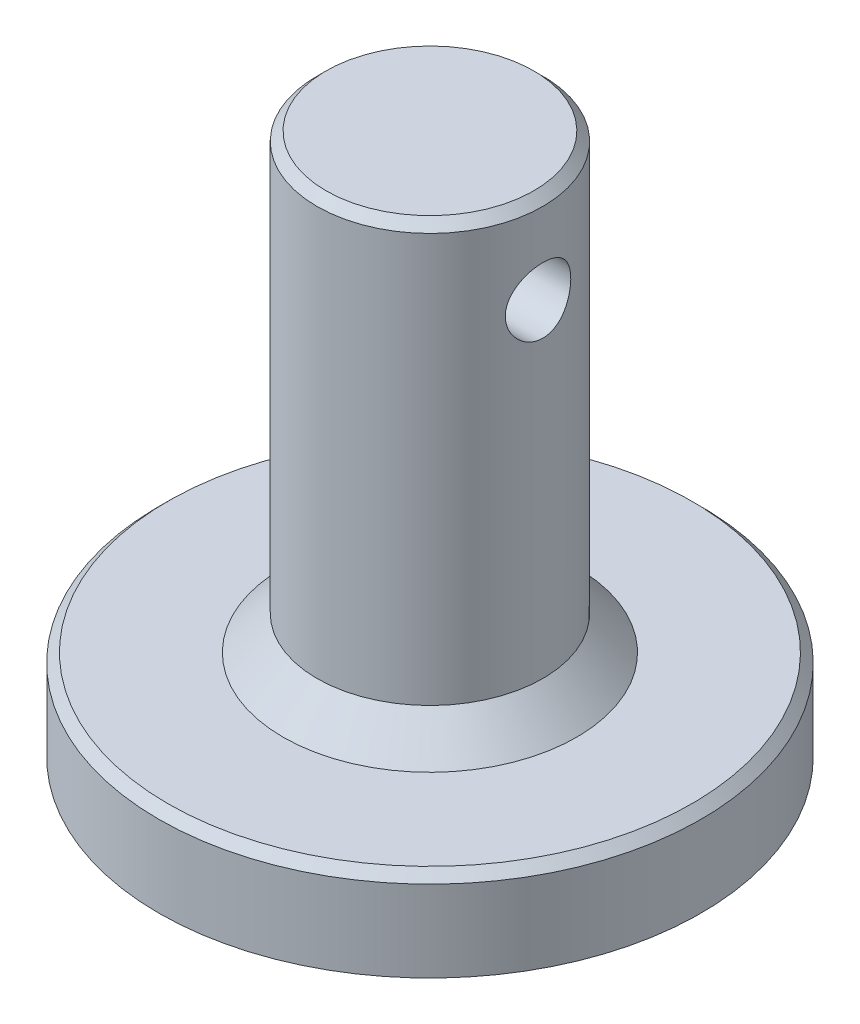
ISO-10303-21;
HEADER;
FILE_DESCRIPTION(('STEP AP214'),'2;1');
FILE_NAME('part.step','',(''),(''),'','','');
FILE_SCHEMA(('AUTOMOTIVE_DESIGN { 1 0 10303 214 1 1 1 1 }'));
ENDSEC;
DATA;
#1=APPLICATION_CONTEXT('core data for automotive mechanical design processes');
#2=APPLICATION_PROTOCOL_DEFINITION('international standard','automotive_design',2000,#1);
#3=PRODUCT_CONTEXT('',#1,'mechanical');
#4=PRODUCT('Part','Part','',(#3));
#5=PRODUCT_RELATED_PRODUCT_CATEGORY('part','',(#4));
#6=PRODUCT_DEFINITION_FORMATION('','',#4);
#7=PRODUCT_DEFINITION_CONTEXT('part definition',#1,'design');
#8=PRODUCT_DEFINITION('design','',#6,#7);
#9=PRODUCT_DEFINITION_SHAPE('','',#8);
#10=(LENGTH_UNIT() NAMED_UNIT(*) SI_UNIT(.MILLI.,.METRE.));
#11=(NAMED_UNIT(*) PLANE_ANGLE_UNIT() SI_UNIT($,.RADIAN.));
#12=(NAMED_UNIT(*) SI_UNIT($,.STERADIAN.) SOLID_ANGLE_UNIT());
#13=UNCERTAINTY_MEASURE_WITH_UNIT(LENGTH_MEASURE(1.E-05),#10,'distance_accuracy_value','');
#14=(GEOMETRIC_REPRESENTATION_CONTEXT(3) GLOBAL_UNCERTAINTY_ASSIGNED_CONTEXT((#13)) GLOBAL_UNIT_ASSIGNED_CONTEXT((#10,
#11,#12)) REPRESENTATION_CONTEXT('',''));
#15=CARTESIAN_POINT('',(0.,0.,0.));
#16=DIRECTION('',(0.,0.,1.));
#17=DIRECTION('',(1.,0.,0.));
#18=AXIS2_PLACEMENT_3D('',#15,#16,#17);
#19=CARTESIAN_POINT('',(0.,24.,0.));
#20=DIRECTION('',(0.,-1.,0.));
#21=DIRECTION('',(0.,0.,-1.));
#22=AXIS2_PLACEMENT_3D('',#19,#20,#21);
#23=CYLINDRICAL_SURFACE('',#22,5.);
#24=CARTESIAN_POINT('',(0.,5.50000000000001,0.));
#25=DIRECTION('',(0.,1.,0.));
#26=DIRECTION('',(0.,0.,1.));
#27=AXIS2_PLACEMENT_3D('',#24,#25,#26);
#28=CIRCLE('',#27,5.);
#29=CARTESIAN_POINT('',(0.,5.50000000000001,5.));
#30=VERTEX_POINT('',#29);
#31=EDGE_CURVE('E43',#30,#30,#28,.T.);
#32=ORIENTED_EDGE('',*,*,#31,.T.);
#33=EDGE_LOOP('',(#32));
#34=FACE_BOUND('',#33,.T.);
#35=CARTESIAN_POINT('',(0.,23.6,0.));
#36=DIRECTION('',(0.,1.,0.));
#37=DIRECTION('',(0.,0.,1.));
#38=AXIS2_PLACEMENT_3D('',#35,#36,#37);
#39=CIRCLE('',#38,5.);
#40=CARTESIAN_POINT('',(0.,23.6,5.));
#41=VERTEX_POINT('',#40);
#42=EDGE_CURVE('E47',#41,#41,#39,.F.);
#43=ORIENTED_EDGE('',*,*,#42,.T.);
#44=EDGE_LOOP('',(#43));
#45=FACE_BOUND('',#44,.T.);
#46=CARTESIAN_POINT('',(-4.78513322698543,20.,1.45));
#47=CARTESIAN_POINT('',(-4.78513426283408,20.0795870913655,1.44999869100188));
#48=CARTESIAN_POINT('',(-4.78714050925583,20.1591873017141,1.44342517475206));
#49=CARTESIAN_POINT('',(-4.79491923133851,20.316069345042,1.41736687000352));
#50=CARTESIAN_POINT('',(-4.80069315717547,20.3933502733468,1.3978771100105));
#51=CARTESIAN_POINT('',(-4.8152995031418,20.543300587324,1.34669665964465));
#52=CARTESIAN_POINT('',(-4.82412708202329,20.6159770583786,1.31502527312825));
#53=CARTESIAN_POINT('',(-4.8438396591333,20.7550010265229,1.24044319497749));
#54=CARTESIAN_POINT('',(-4.85472492070628,20.8213477118826,1.19753106446917));
#55=CARTESIAN_POINT('',(-4.87768729729169,20.9477906612898,1.10032746628817));
#56=CARTESIAN_POINT('',(-4.88978851764016,21.0076720528303,1.04576212367778));
#57=CARTESIAN_POINT('',(-4.91361274134648,21.1175752846992,0.927388593971664));
#58=CARTESIAN_POINT('',(-4.92533569902584,21.1675959379569,0.863579295657844));
#59=CARTESIAN_POINT('',(-4.94735485828962,21.2572792601641,0.72701260523335));
#60=CARTESIAN_POINT('',(-4.95761933344942,21.2967245432166,0.654106893761896));
#61=CARTESIAN_POINT('',(-4.97528602486809,21.3627131517366,0.502349395141127));
#62=CARTESIAN_POINT('',(-4.98268881596986,21.3892590686494,0.423498805980456));
#63=CARTESIAN_POINT('',(-4.99362752260969,21.4279892086208,0.264336285612595));
#64=CARTESIAN_POINT('',(-4.99726190344405,21.4405398180832,0.184120398070293));
#65=CARTESIAN_POINT('',(-5.0006002774265,21.4520797882142,0.022644720735508));
#66=CARTESIAN_POINT('',(-5.00030504377207,21.4510718166913,-0.0586148605545906));
#67=CARTESIAN_POINT('',(-4.9958878510329,21.4357729409259,-0.217307208791277));
#68=CARTESIAN_POINT('',(-4.99188011560564,21.4218785030943,-0.294781872826383));
#69=CARTESIAN_POINT('',(-4.98062578548084,21.3818465095015,-0.446248527310061));
#70=CARTESIAN_POINT('',(-4.97337899118619,21.3557081992443,-0.520240302825636));
#71=CARTESIAN_POINT('',(-4.95629932571502,21.2916511473883,-0.663604820945453));
#72=CARTESIAN_POINT('',(-4.94643851687521,21.2536042857988,-0.732916852546144));
#73=CARTESIAN_POINT('',(-4.92518200579398,21.1669104820133,-0.864302061741751));
#74=CARTESIAN_POINT('',(-4.91378595906077,21.1182611592149,-0.92637360879579));
#75=CARTESIAN_POINT('',(-4.89019767838047,21.009671710933,-1.04388263721356));
#76=CARTESIAN_POINT('',(-4.87799155397245,20.9493872555907,-1.09899954763512));
#77=CARTESIAN_POINT('',(-4.85452227840415,20.8203091860323,-1.19842825418313));
#78=CARTESIAN_POINT('',(-4.84325920868936,20.7515148381406,-1.24273911769258));
#79=CARTESIAN_POINT('',(-4.82288798893475,20.6065727314494,-1.31960328482008));
#80=CARTESIAN_POINT('',(-4.81379883432215,20.5303677955544,-1.35205416836745));
#81=CARTESIAN_POINT('',(-4.79903258643307,20.373251542667,-1.40357136759515));
#82=CARTESIAN_POINT('',(-4.79335446529496,20.2923416515077,-1.422641715582));
#83=CARTESIAN_POINT('',(-4.78627675987833,20.1311470156077,-1.44627196475718));
#84=CARTESIAN_POINT('',(-4.78473438843888,20.0509394976596,-1.45131635027333));
#85=CARTESIAN_POINT('',(-4.78570925484049,19.8908236603967,-1.44809884432744));
#86=CARTESIAN_POINT('',(-4.78822596830652,19.8109153037712,-1.43983867162193));
#87=CARTESIAN_POINT('',(-4.7968959615428,19.6556379368374,-1.41067672473847));
#88=CARTESIAN_POINT('',(-4.80296129588655,19.5802061593392,-1.39008039401309));
#89=CARTESIAN_POINT('',(-4.81795561312468,19.4338718536094,-1.33718157289373));
#90=CARTESIAN_POINT('',(-4.826885017938,19.3629699945466,-1.30487735766814));
#91=CARTESIAN_POINT('',(-4.84688324748324,19.225720092423,-1.22854093128491));
#92=CARTESIAN_POINT('',(-4.85800060286684,19.1595332188973,-1.18423196789368));
#93=CARTESIAN_POINT('',(-4.88101483844608,19.0353568761904,-1.08547687518715));
#94=CARTESIAN_POINT('',(-4.89291189242326,18.9773692436364,-1.03102848095157));
#95=CARTESIAN_POINT('',(-4.91664804907019,18.8691522005977,-0.91127366957764));
#96=CARTESIAN_POINT('',(-4.92847060897607,18.8192645739359,-0.845654391675095));
#97=CARTESIAN_POINT('',(-4.95030472487494,18.7312044311332,-0.706697986188916));
#98=CARTESIAN_POINT('',(-4.96031637443399,18.6930313096567,-0.633361257660164));
#99=CARTESIAN_POINT('',(-4.97733750401775,18.6298499779853,-0.481553911308572));
#100=CARTESIAN_POINT('',(-4.98436958850299,18.6047423020208,-0.403127351540741));
#101=CARTESIAN_POINT('',(-4.99473912169655,18.5681371404963,-0.242929422773563));
#102=CARTESIAN_POINT('',(-4.99807755208951,18.556636038579,-0.161158948500439));
#103=CARTESIAN_POINT('',(-5.00062799407149,18.5478307187522,0.000236873074977497));
#104=CARTESIAN_POINT('',(-4.99998455668778,18.5500291950276,0.079833155333161));
#105=CARTESIAN_POINT('',(-4.99497996377191,18.5673824255604,0.237474636793753));
#106=CARTESIAN_POINT('',(-4.99061899573652,18.5825365263902,0.31551991401925));
#107=CARTESIAN_POINT('',(-4.97870683527859,18.6250706578737,0.467131271714106));
#108=CARTESIAN_POINT('',(-4.97118619722582,18.652333734033,0.540732726836403));
#109=CARTESIAN_POINT('',(-4.95373455662155,18.7182077726595,0.682356817223569));
#110=CARTESIAN_POINT('',(-4.94380317373496,18.7568205259301,0.750378569929745));
#111=CARTESIAN_POINT('',(-4.92220347877844,18.8456622812737,0.881159638715791));
#112=CARTESIAN_POINT('',(-4.91049151852829,18.8962089269919,0.943695916936211));
#113=CARTESIAN_POINT('',(-4.88680109909446,19.0069022747151,1.05956576561686));
#114=CARTESIAN_POINT('',(-4.87482256618544,19.0670516616519,1.11289675356803));
#115=CARTESIAN_POINT('',(-4.85157276285652,19.1972154373184,1.21029846596509));
#116=CARTESIAN_POINT('',(-4.84032972653636,19.2674543038983,1.25407665289222));
#117=CARTESIAN_POINT('',(-4.82025779384607,19.414611238388,1.32914783845825));
#118=CARTESIAN_POINT('',(-4.81142760251926,19.4915256942343,1.36044753836902));
#119=CARTESIAN_POINT('',(-4.79816656435598,19.6399143111036,1.40644791063515));
#120=CARTESIAN_POINT('',(-4.79332309408559,19.7108624483056,1.42273711459614));
#121=CARTESIAN_POINT('',(-4.78680622092027,19.8545369402224,1.44451284122198));
#122=CARTESIAN_POINT('',(-4.78513228029255,19.9272629911807,1.45000119633229));
#123=CARTESIAN_POINT('',(-4.78513322698543,20.,1.45));
#124=B_SPLINE_CURVE_WITH_KNOTS('',3,(#46,#47,#48,#49,#50,#51,#52,#53,#54,#55,#56,#57,#58,#59,
#60,#61,#62,#63,#64,#65,#66,#67,#68,#69,#70,#71,#72,#73,#74,#75,#76,#77,#78,#79,#80,#81,#82,#83,
#84,#85,#86,#87,#88,#89,#90,#91,#92,#93,#94,#95,#96,#97,#98,#99,#100,#101,#102,#103,#104,#105,
#106,#107,#108,#109,#110,#111,#112,#113,#114,#115,#116,#117,#118,#119,#120,#121,#122,#123),
.UNSPECIFIED.,.T.,.F.,(4,2,2,2,2,2,2,2,2,2,2,2,2,2,2,2,2,2,2,2,2,2,2,2,2,2,2,2,2,2,2,2,2,2,2,2,
2,2,4),(0.,0.238493232961865,0.477078315918092,0.715286867697191,0.953525926328666,
1.19814270558598,1.4427889147217,1.69213378520628,1.94142854229716,2.18403142188755,
2.42658656723769,2.66191829753567,2.897264531433,3.13523524914161,3.37325945428162,
3.61988037805959,3.86652257895531,4.11524702860239,4.36389649137938,4.60384360292594,
4.84375971926139,5.07796777486047,5.31221034854688,5.55239577617267,5.7926349203059,
6.04126639344753,6.28988501663377,6.53658217453045,6.78321375047938,7.02094586303766,
7.25866598608788,7.4941383970501,7.7296479818753,7.97232198904239,8.21506396720954,
8.46443250768818,8.7136669498048,8.93166999455157,9.14963605024806),.UNSPECIFIED.);
#125=CARTESIAN_POINT('',(-4.78513322698543,20.,1.45));
#126=VERTEX_POINT('',#125);
#127=EDGE_CURVE('E63',#126,#126,#124,.T.);
#128=ORIENTED_EDGE('',*,*,#127,.F.);
#129=EDGE_LOOP('',(#128));
#130=FACE_BOUND('',#129,.T.);
#131=CARTESIAN_POINT('',(4.78513322698543,20.,1.45));
#132=CARTESIAN_POINT('',(4.78513426283408,19.9204129086345,1.44999869100188));
#133=CARTESIAN_POINT('',(4.78714050925583,19.8408126982859,1.44342517475206));
#134=CARTESIAN_POINT('',(4.79491923133851,19.683930654958,1.41736687000352));
#135=CARTESIAN_POINT('',(4.80069315717547,19.6066497266532,1.3978771100105));
#136=CARTESIAN_POINT('',(4.8152995031418,19.456699412676,1.34669665964465));
#137=CARTESIAN_POINT('',(4.82412708202329,19.3840229416214,1.31502527312825));
#138=CARTESIAN_POINT('',(4.8438396591333,19.2449989734771,1.24044319497749));
#139=CARTESIAN_POINT('',(4.85472492070628,19.1786522881174,1.19753106446916));
#140=CARTESIAN_POINT('',(4.87768729729169,19.0522093387101,1.10032746628817));
#141=CARTESIAN_POINT('',(4.88978851764016,18.9923279471697,1.04576212367778));
#142=CARTESIAN_POINT('',(4.91361274134648,18.8824247153008,0.927388593971658));
#143=CARTESIAN_POINT('',(4.92533569902584,18.8324040620431,0.863579295657839));
#144=CARTESIAN_POINT('',(4.94735485828962,18.7427207398359,0.727012605233345));
#145=CARTESIAN_POINT('',(4.95761933344942,18.7032754567834,0.654106893761891));
#146=CARTESIAN_POINT('',(4.97528602486809,18.6372868482634,0.502349395141122));
#147=CARTESIAN_POINT('',(4.98268881596986,18.6107409313506,0.423498805980451));
#148=CARTESIAN_POINT('',(4.99362752260969,18.5720107913792,0.26433628561259));
#149=CARTESIAN_POINT('',(4.99726190344405,18.5594601819168,0.184120398070288));
#150=CARTESIAN_POINT('',(5.0006002774265,18.5479202117858,0.0226447207355032));
#151=CARTESIAN_POINT('',(5.00030504377207,18.5489281833087,-0.0586148605545953));
#152=CARTESIAN_POINT('',(4.9958878510329,18.5642270590741,-0.217307208791282));
#153=CARTESIAN_POINT('',(4.99188011560564,18.5781214969057,-0.294781872826387));
#154=CARTESIAN_POINT('',(4.98062578548084,18.6181534904985,-0.446248527310065));
#155=CARTESIAN_POINT('',(4.97337899118619,18.6442918007557,-0.52024030282564));
#156=CARTESIAN_POINT('',(4.95629932571502,18.7083488526117,-0.663604820945455));
#157=CARTESIAN_POINT('',(4.94643851687521,18.7463957142012,-0.732916852546146));
#158=CARTESIAN_POINT('',(4.92518200579398,18.8330895179867,-0.864302061741752));
#159=CARTESIAN_POINT('',(4.91378595906077,18.8817388407851,-0.926373608795792));
#160=CARTESIAN_POINT('',(4.89019767838047,18.990328289067,-1.04388263721356));
#161=CARTESIAN_POINT('',(4.87799155397245,19.0506127444093,-1.09899954763512));
#162=CARTESIAN_POINT('',(4.85452227840415,19.1796908139677,-1.19842825418313));
#163=CARTESIAN_POINT('',(4.84325920868936,19.2484851618594,-1.24273911769258));
#164=CARTESIAN_POINT('',(4.82288798893475,19.3934272685506,-1.31960328482009));
#165=CARTESIAN_POINT('',(4.81379883432215,19.4696322044456,-1.35205416836745));
#166=CARTESIAN_POINT('',(4.79903258643307,19.626748457333,-1.40357136759515));
#167=CARTESIAN_POINT('',(4.79335446529496,19.7076583484923,-1.422641715582));
#168=CARTESIAN_POINT('',(4.78627675987833,19.8688529843923,-1.44627196475718));
#169=CARTESIAN_POINT('',(4.78473438843888,19.9490605023404,-1.45131635027333));
#170=CARTESIAN_POINT('',(4.78570925484049,20.1091763396033,-1.44809884432744));
#171=CARTESIAN_POINT('',(4.78822596830652,20.1890846962288,-1.43983867162193));
#172=CARTESIAN_POINT('',(4.7968959615428,20.3443620631627,-1.41067672473847));
#173=CARTESIAN_POINT('',(4.80296129588655,20.4197938406608,-1.39008039401309));
#174=CARTESIAN_POINT('',(4.81795561312468,20.5661281463906,-1.33718157289373));
#175=CARTESIAN_POINT('',(4.826885017938,20.6370300054534,-1.30487735766814));
#176=CARTESIAN_POINT('',(4.84688324748324,20.774279907577,-1.22854093128491));
#177=CARTESIAN_POINT('',(4.85800060286684,20.8404667811027,-1.18423196789368));
#178=CARTESIAN_POINT('',(4.88101483844608,20.9646431238096,-1.08547687518714));
#179=CARTESIAN_POINT('',(4.89291189242326,21.0226307563636,-1.03102848095157));
#180=CARTESIAN_POINT('',(4.91664804907019,21.1308477994023,-0.911273669577635));
#181=CARTESIAN_POINT('',(4.92847060897607,21.1807354260641,-0.84565439167509));
#182=CARTESIAN_POINT('',(4.95030472487494,21.2687955688668,-0.70669798618891));
#183=CARTESIAN_POINT('',(4.96031637443399,21.3069686903433,-0.633361257660158));
#184=CARTESIAN_POINT('',(4.97733750401775,21.3701500220147,-0.481553911308565));
#185=CARTESIAN_POINT('',(4.98436958850299,21.3952576979792,-0.403127351540734));
#186=CARTESIAN_POINT('',(4.99473912169655,21.4318628595037,-0.242929422773557));
#187=CARTESIAN_POINT('',(4.99807755208951,21.443363961421,-0.161158948500434));
#188=CARTESIAN_POINT('',(5.00062799407149,21.4521692812478,0.000236873074982267));
#189=CARTESIAN_POINT('',(4.99998455668778,21.4499708049724,0.0798331553331657));
#190=CARTESIAN_POINT('',(4.99497996377191,21.4326175744396,0.237474636793757));
#191=CARTESIAN_POINT('',(4.99061899573652,21.4174634736098,0.315519914019254));
#192=CARTESIAN_POINT('',(4.97870683527859,21.3749293421263,0.46713127171411));
#193=CARTESIAN_POINT('',(4.97118619722582,21.347666265967,0.540732726836407));
#194=CARTESIAN_POINT('',(4.95373455662155,21.2817922273405,0.682356817223572));
#195=CARTESIAN_POINT('',(4.94380317373496,21.2431794740699,0.750378569929747));
#196=CARTESIAN_POINT('',(4.92220347877844,21.1543377187263,0.881159638715793));
#197=CARTESIAN_POINT('',(4.91049151852829,21.1037910730081,0.943695916936212));
#198=CARTESIAN_POINT('',(4.88680109909446,20.9930977252849,1.05956576561686));
#199=CARTESIAN_POINT('',(4.87482256618544,20.9329483383481,1.11289675356803));
#200=CARTESIAN_POINT('',(4.85157276285652,20.8027845626816,1.21029846596509));
#201=CARTESIAN_POINT('',(4.84032972653636,20.7325456961017,1.25407665289222));
#202=CARTESIAN_POINT('',(4.82025779384607,20.585388761612,1.32914783845825));
#203=CARTESIAN_POINT('',(4.81142760251926,20.5084743057657,1.36044753836902));
#204=CARTESIAN_POINT('',(4.79816656435598,20.3600856888964,1.40644791063515));
#205=CARTESIAN_POINT('',(4.79332309408559,20.2891375516944,1.42273711459614));
#206=CARTESIAN_POINT('',(4.78680622092027,20.1454630597776,1.44451284122198));
#207=CARTESIAN_POINT('',(4.78513228029255,20.0727370088193,1.45000119633229));
#208=CARTESIAN_POINT('',(4.78513322698543,20.,1.45));
#209=B_SPLINE_CURVE_WITH_KNOTS('',3,(#131,#132,#133,#134,#135,#136,#137,#138,#139,#140,#141,
#142,#143,#144,#145,#146,#147,#148,#149,#150,#151,#152,#153,#154,#155,#156,#157,#158,#159,#160,
#161,#162,#163,#164,#165,#166,#167,#168,#169,#170,#171,#172,#173,#174,#175,#176,#177,#178,#179,
#180,#181,#182,#183,#184,#185,#186,#187,#188,#189,#190,#191,#192,#193,#194,#195,#196,#197,#198,
#199,#200,#201,#202,#203,#204,#205,#206,#207,#208),.UNSPECIFIED.,.T.,.F.,(4,2,2,2,2,2,2,2,2,2,2,
2,2,2,2,2,2,2,2,2,2,2,2,2,2,2,2,2,2,2,2,2,2,2,2,2,2,2,4),(0.,0.238493232961868,
0.477078315918096,0.715286867697195,0.95352592632867,1.19814270558599,1.44278891472171,
1.69213378520629,1.94142854229716,2.18403142188755,2.42658656723769,2.66191829753568,
2.897264531433,3.13523524914162,3.37325945428162,3.6198803780596,3.86652257895531,
4.1152470286024,4.36389649137938,4.60384360292594,4.84375971926139,5.07796777486048,
5.31221034854688,5.55239577617268,5.79263492030591,6.04126639344754,6.28988501663378,
6.53658217453046,6.78321375047939,7.02094586303767,7.25866598608789,7.49413839705011,
7.72964798187531,7.9723219890424,8.21506396720955,8.46443250768818,8.7136669498048,
8.93166999455158,9.14963605024806),.UNSPECIFIED.);
#210=CARTESIAN_POINT('',(4.78513322698543,20.,1.45));
#211=VERTEX_POINT('',#210);
#212=EDGE_CURVE('E54',#211,#211,#209,.T.);
#213=ORIENTED_EDGE('',*,*,#212,.F.);
#214=EDGE_LOOP('',(#213));
#215=FACE_BOUND('',#214,.T.);
#216=ADVANCED_FACE('F35',(#34,#45,#130,#215),#23,.T.);
#217=CARTESIAN_POINT('',(0.,4.,0.));
#218=DIRECTION('',(0.,-1.,0.));
#219=DIRECTION('',(0.,0.,-1.));
#220=AXIS2_PLACEMENT_3D('',#217,#218,#219);
#221=CYLINDRICAL_SURFACE('',#220,12.);
#222=CARTESIAN_POINT('',(0.,3.6,0.));
#223=DIRECTION('',(0.,1.,0.));
#224=DIRECTION('',(0.,0.,1.));
#225=AXIS2_PLACEMENT_3D('',#222,#223,#224);
#226=CIRCLE('',#225,12.);
#227=CARTESIAN_POINT('',(0.,3.6,12.));
#228=VERTEX_POINT('',#227);
#229=EDGE_CURVE('E110',#228,#228,#226,.F.);
#230=ORIENTED_EDGE('',*,*,#229,.T.);
#231=EDGE_LOOP('',(#230));
#232=FACE_BOUND('',#231,.T.);
#233=CARTESIAN_POINT('',(0.,0.,0.));
#234=DIRECTION('',(0.,1.,0.));
#235=DIRECTION('',(0.,0.,1.));
#236=AXIS2_PLACEMENT_3D('',#233,#234,#235);
#237=CIRCLE('',#236,12.);
#238=CARTESIAN_POINT('',(0.,0.,12.));
#239=VERTEX_POINT('',#238);
#240=EDGE_CURVE('E62',#239,#239,#237,.T.);
#241=ORIENTED_EDGE('',*,*,#240,.T.);
#242=EDGE_LOOP('',(#241));
#243=FACE_BOUND('',#242,.T.);
#244=ADVANCED_FACE('F92',(#232,#243),#221,.T.);
#245=CARTESIAN_POINT('',(0.,4.,0.));
#246=DIRECTION('',(0.,1.,0.));
#247=DIRECTION('',(0.,0.,1.));
#248=AXIS2_PLACEMENT_3D('',#245,#246,#247);
#249=PLANE('',#248);
#250=CARTESIAN_POINT('',(0.,4.,0.));
#251=DIRECTION('',(0.,1.,0.));
#252=DIRECTION('',(0.,0.,1.));
#253=AXIS2_PLACEMENT_3D('',#250,#251,#252);
#254=CIRCLE('',#253,6.49999999999998);
#255=CARTESIAN_POINT('',(0.,4.,6.49999999999998));
#256=VERTEX_POINT('',#255);
#257=EDGE_CURVE('E10',#256,#256,#254,.F.);
#258=ORIENTED_EDGE('',*,*,#257,.T.);
#259=EDGE_LOOP('',(#258));
#260=FACE_BOUND('',#259,.T.);
#261=CARTESIAN_POINT('',(0.,4.,0.));
#262=DIRECTION('',(0.,1.,0.));
#263=DIRECTION('',(0.,0.,1.));
#264=AXIS2_PLACEMENT_3D('',#261,#262,#263);
#265=CIRCLE('',#264,11.6);
#266=CARTESIAN_POINT('',(0.,4.,11.6));
#267=VERTEX_POINT('',#266);
#268=EDGE_CURVE('E113',#267,#267,#265,.T.);
#269=ORIENTED_EDGE('',*,*,#268,.T.);
#270=EDGE_LOOP('',(#269));
#271=FACE_BOUND('',#270,.T.);
#272=ADVANCED_FACE('F87',(#260,#271),#249,.T.);
#273=CARTESIAN_POINT('',(0.,0.,0.));
#274=DIRECTION('',(0.,1.,0.));
#275=DIRECTION('',(0.,0.,1.));
#276=AXIS2_PLACEMENT_3D('',#273,#274,#275);
#277=PLANE('',#276);
#278=ORIENTED_EDGE('',*,*,#240,.F.);
#279=EDGE_LOOP('',(#278));
#280=FACE_BOUND('',#279,.T.);
#281=ADVANCED_FACE('F79',(#280),#277,.F.);
#282=CARTESIAN_POINT('',(0.,24.,0.));
#283=DIRECTION('',(0.,1.,0.));
#284=DIRECTION('',(0.,0.,1.));
#285=AXIS2_PLACEMENT_3D('',#282,#283,#284);
#286=PLANE('',#285);
#287=CARTESIAN_POINT('',(0.,24.,0.));
#288=DIRECTION('',(0.,1.,0.));
#289=DIRECTION('',(0.,0.,1.));
#290=AXIS2_PLACEMENT_3D('',#287,#288,#289);
#291=CIRCLE('',#290,4.6);
#292=CARTESIAN_POINT('',(0.,24.,4.6));
#293=VERTEX_POINT('',#292);
#294=EDGE_CURVE('E51',#293,#293,#291,.T.);
#295=ORIENTED_EDGE('',*,*,#294,.T.);
#296=EDGE_LOOP('',(#295));
#297=FACE_BOUND('',#296,.T.);
#298=ADVANCED_FACE('F75',(#297),#286,.T.);
#299=CARTESIAN_POINT('',(0.,4.,0.));
#300=DIRECTION('',(0.,-1.,0.));
#301=DIRECTION('',(0.,0.,-1.));
#302=AXIS2_PLACEMENT_3D('',#299,#300,#301);
#303=CONICAL_SURFACE('',#302,11.6,0.785398163397448);
#304=ORIENTED_EDGE('',*,*,#229,.F.);
#305=EDGE_LOOP('',(#304));
#306=FACE_BOUND('',#305,.T.);
#307=ORIENTED_EDGE('',*,*,#268,.F.);
#308=EDGE_LOOP('',(#307));
#309=FACE_BOUND('',#308,.T.);
#310=ADVANCED_FACE('F78',(#306,#309),#303,.T.);
#311=CARTESIAN_POINT('',(0.,24.,0.));
#312=DIRECTION('',(0.,-1.,0.));
#313=DIRECTION('',(0.,0.,-1.));
#314=AXIS2_PLACEMENT_3D('',#311,#312,#313);
#315=CONICAL_SURFACE('',#314,4.6,0.785398163397456);
#316=ORIENTED_EDGE('',*,*,#42,.F.);
#317=EDGE_LOOP('',(#316));
#318=FACE_BOUND('',#317,.T.);
#319=ORIENTED_EDGE('',*,*,#294,.F.);
#320=EDGE_LOOP('',(#319));
#321=FACE_BOUND('',#320,.T.);
#322=ADVANCED_FACE('F73',(#318,#321),#315,.T.);
#323=CARTESIAN_POINT('',(12.,20.,0.));
#324=DIRECTION('',(-1.,0.,0.));
#325=DIRECTION('',(0.,0.,1.));
#326=AXIS2_PLACEMENT_3D('',#323,#324,#325);
#327=CYLINDRICAL_SURFACE('',#326,1.45);
#328=ORIENTED_EDGE('',*,*,#127,.T.);
#329=EDGE_LOOP('',(#328));
#330=FACE_BOUND('',#329,.T.);
#331=ORIENTED_EDGE('',*,*,#212,.T.);
#332=EDGE_LOOP('',(#331));
#333=FACE_BOUND('',#332,.T.);
#334=ADVANCED_FACE('F70',(#330,#333),#327,.F.);
#335=CARTESIAN_POINT('',(0.,5.50000000000001,0.));
#336=DIRECTION('',(0.,-1.,0.));
#337=DIRECTION('',(0.,0.,-1.));
#338=AXIS2_PLACEMENT_3D('',#335,#336,#337);
#339=CONICAL_SURFACE('',#338,5.,0.785398163397442);
#340=ORIENTED_EDGE('',*,*,#257,.F.);
#341=EDGE_LOOP('',(#340));
#342=FACE_BOUND('',#341,.T.);
#343=ORIENTED_EDGE('',*,*,#31,.F.);
#344=EDGE_LOOP('',(#343));
#345=FACE_BOUND('',#344,.T.);
#346=ADVANCED_FACE('F38',(#342,#345),#339,.T.);
#347=CLOSED_SHELL('',(#216,#244,#272,#281,#298,#310,#322,#334,#346));
#348=MANIFOLD_SOLID_BREP('B2',#347);
#349=ADVANCED_BREP_SHAPE_REPRESENTATION('',(#18,#348),#14);
#350=SHAPE_DEFINITION_REPRESENTATION(#9,#349);
ENDSEC;
END-ISO-10303-21;
